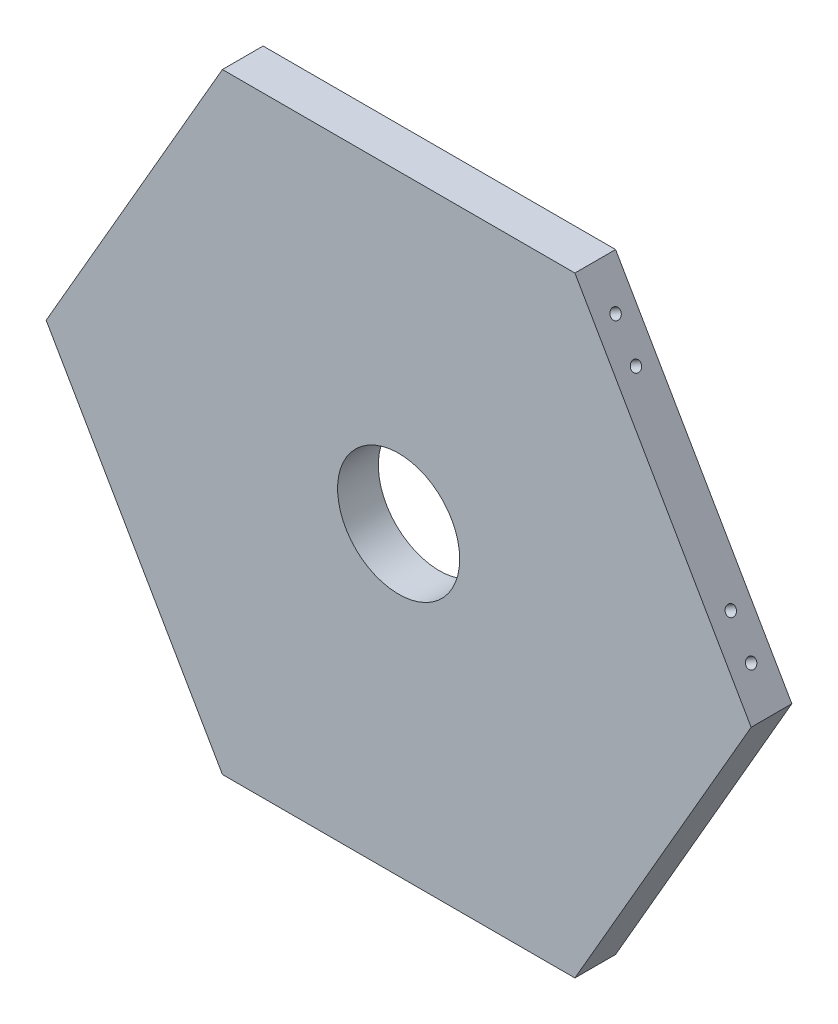
ISO-10303-21;
HEADER;
FILE_DESCRIPTION(('STEP AP214'),'2;1');
FILE_NAME('part.step','',(''),(''),'','','');
FILE_SCHEMA(('AUTOMOTIVE_DESIGN { 1 0 10303 214 1 1 1 1 }'));
ENDSEC;
DATA;
#1=APPLICATION_CONTEXT('core data for automotive mechanical design processes');
#2=APPLICATION_PROTOCOL_DEFINITION('international standard','automotive_design',2000,#1);
#3=PRODUCT_CONTEXT('',#1,'mechanical');
#4=PRODUCT('Part','Part','',(#3));
#5=PRODUCT_RELATED_PRODUCT_CATEGORY('part','',(#4));
#6=PRODUCT_DEFINITION_FORMATION('','',#4);
#7=PRODUCT_DEFINITION_CONTEXT('part definition',#1,'design');
#8=PRODUCT_DEFINITION('design','',#6,#7);
#9=PRODUCT_DEFINITION_SHAPE('','',#8);
#10=(LENGTH_UNIT() NAMED_UNIT(*) SI_UNIT(.MILLI.,.METRE.));
#11=(NAMED_UNIT(*) PLANE_ANGLE_UNIT() SI_UNIT($,.RADIAN.));
#12=(NAMED_UNIT(*) SI_UNIT($,.STERADIAN.) SOLID_ANGLE_UNIT());
#13=UNCERTAINTY_MEASURE_WITH_UNIT(LENGTH_MEASURE(1.E-05),#10,'distance_accuracy_value','');
#14=(GEOMETRIC_REPRESENTATION_CONTEXT(3) GLOBAL_UNCERTAINTY_ASSIGNED_CONTEXT((#13)) GLOBAL_UNIT_ASSIGNED_CONTEXT((#10,
#11,#12)) REPRESENTATION_CONTEXT('',''));
#15=CARTESIAN_POINT('',(0.,0.,0.));
#16=DIRECTION('',(0.,0.,1.));
#17=DIRECTION('',(1.,0.,0.));
#18=AXIS2_PLACEMENT_3D('',#15,#16,#17);
#19=CARTESIAN_POINT('',(-43.301270189222,-75.,10.));
#20=DIRECTION('',(0.,1.,0.));
#21=DIRECTION('',(-1.,0.,0.));
#22=AXIS2_PLACEMENT_3D('',#19,#20,#21);
#23=PLANE('',#22);
#24=CARTESIAN_POINT('',(-33.301270189222,-75.,5.));
#25=DIRECTION('',(0.,-1.,0.));
#26=DIRECTION('',(1.,0.,0.));
#27=AXIS2_PLACEMENT_3D('',#24,#25,#26);
#28=CIRCLE('',#27,1.25);
#29=CARTESIAN_POINT('',(-32.051270189222,-75.,5.));
#30=VERTEX_POINT('',#29);
#31=EDGE_CURVE('E187',#30,#30,#28,.T.);
#32=ORIENTED_EDGE('',*,*,#31,.F.);
#33=EDGE_LOOP('',(#32));
#34=FACE_BOUND('',#33,.T.);
#35=CARTESIAN_POINT('',(23.3012701892219,-75.,5.));
#36=DIRECTION('',(0.,-1.,0.));
#37=DIRECTION('',(-1.,0.,0.));
#38=AXIS2_PLACEMENT_3D('',#35,#36,#37);
#39=CIRCLE('',#38,1.25);
#40=CARTESIAN_POINT('',(22.0512701892219,-75.,5.));
#41=VERTEX_POINT('',#40);
#42=EDGE_CURVE('E191',#41,#41,#39,.T.);
#43=ORIENTED_EDGE('',*,*,#42,.F.);
#44=EDGE_LOOP('',(#43));
#45=FACE_BOUND('',#44,.T.);
#46=CARTESIAN_POINT('',(33.3012701892219,-75.,5.));
#47=DIRECTION('',(0.,-1.,0.));
#48=DIRECTION('',(-1.,0.,0.));
#49=AXIS2_PLACEMENT_3D('',#46,#47,#48);
#50=CIRCLE('',#49,1.25);
#51=CARTESIAN_POINT('',(32.0512701892219,-75.,5.));
#52=VERTEX_POINT('',#51);
#53=EDGE_CURVE('E195',#52,#52,#50,.T.);
#54=ORIENTED_EDGE('',*,*,#53,.F.);
#55=EDGE_LOOP('',(#54));
#56=FACE_BOUND('',#55,.T.);
#57=CARTESIAN_POINT('',(-23.301270189222,-75.,5.));
#58=DIRECTION('',(0.,-1.,0.));
#59=DIRECTION('',(1.,0.,0.));
#60=AXIS2_PLACEMENT_3D('',#57,#58,#59);
#61=CIRCLE('',#60,1.25);
#62=CARTESIAN_POINT('',(-22.051270189222,-75.,5.));
#63=VERTEX_POINT('',#62);
#64=EDGE_CURVE('E198',#63,#63,#61,.T.);
#65=ORIENTED_EDGE('',*,*,#64,.F.);
#66=EDGE_LOOP('',(#65));
#67=FACE_BOUND('',#66,.T.);
#68=DIRECTION('',(1.,0.,0.));
#69=VECTOR('',#68,1.);
#70=CARTESIAN_POINT('',(-43.301270189222,-75.,0.));
#71=LINE('',#70,#69);
#72=CARTESIAN_POINT('',(-43.301270189222,-75.,0.));
#73=VERTEX_POINT('',#72);
#74=CARTESIAN_POINT('',(43.3012701892219,-75.,0.));
#75=VERTEX_POINT('',#74);
#76=EDGE_CURVE('E131',#73,#75,#71,.T.);
#77=ORIENTED_EDGE('',*,*,#76,.T.);
#78=DIRECTION('',(0.,0.,-1.));
#79=VECTOR('',#78,1.);
#80=CARTESIAN_POINT('',(43.3012701892219,-75.,10.));
#81=LINE('',#80,#79);
#82=CARTESIAN_POINT('',(43.3012701892219,-75.,10.));
#83=VERTEX_POINT('',#82);
#84=EDGE_CURVE('E11',#83,#75,#81,.T.);
#85=ORIENTED_EDGE('',*,*,#84,.F.);
#86=DIRECTION('',(1.,0.,0.));
#87=VECTOR('',#86,1.);
#88=CARTESIAN_POINT('',(-43.301270189222,-75.,10.));
#89=LINE('',#88,#87);
#90=CARTESIAN_POINT('',(-43.301270189222,-75.,10.));
#91=VERTEX_POINT('',#90);
#92=EDGE_CURVE('E148',#91,#83,#89,.T.);
#93=ORIENTED_EDGE('',*,*,#92,.F.);
#94=DIRECTION('',(0.,0.,-1.));
#95=VECTOR('',#94,1.);
#96=CARTESIAN_POINT('',(-43.301270189222,-75.,10.));
#97=LINE('',#96,#95);
#98=EDGE_CURVE('E127',#91,#73,#97,.T.);
#99=ORIENTED_EDGE('',*,*,#98,.T.);
#100=EDGE_LOOP('',(#77,#85,#93,#99));
#101=FACE_BOUND('',#100,.T.);
#102=ADVANCED_FACE('F42',(#34,#45,#56,#67,#101),#23,.F.);
#103=CARTESIAN_POINT('',(43.3012701892219,-75.,10.));
#104=DIRECTION('',(-0.866025403784438,0.5,0.));
#105=DIRECTION('',(-0.5,-0.866025403784439,0.));
#106=AXIS2_PLACEMENT_3D('',#103,#104,#105);
#107=PLANE('',#106);
#108=DIRECTION('',(0.5,0.866025403784438,0.));
#109=VECTOR('',#108,1.);
#110=CARTESIAN_POINT('',(43.3012701892219,-75.,0.));
#111=LINE('',#110,#109);
#112=CARTESIAN_POINT('',(86.6025403784439,0.,0.));
#113=VERTEX_POINT('',#112);
#114=EDGE_CURVE('E135',#75,#113,#111,.T.);
#115=ORIENTED_EDGE('',*,*,#114,.T.);
#116=DIRECTION('',(0.,0.,-1.));
#117=VECTOR('',#116,1.);
#118=CARTESIAN_POINT('',(86.6025403784439,0.,10.));
#119=LINE('',#118,#117);
#120=CARTESIAN_POINT('',(86.6025403784439,0.,10.));
#121=VERTEX_POINT('',#120);
#122=EDGE_CURVE('E51',#121,#113,#119,.T.);
#123=ORIENTED_EDGE('',*,*,#122,.F.);
#124=DIRECTION('',(0.5,0.866025403784438,0.));
#125=VECTOR('',#124,1.);
#126=CARTESIAN_POINT('',(43.3012701892219,-75.,10.));
#127=LINE('',#126,#125);
#128=EDGE_CURVE('E96',#83,#121,#127,.T.);
#129=ORIENTED_EDGE('',*,*,#128,.F.);
#130=ORIENTED_EDGE('',*,*,#84,.T.);
#131=EDGE_LOOP('',(#115,#123,#129,#130));
#132=FACE_BOUND('',#131,.T.);
#133=ADVANCED_FACE('F179',(#132),#107,.F.);
#134=CARTESIAN_POINT('',(86.6025403784439,0.,10.));
#135=DIRECTION('',(-0.866025403784439,-0.5,0.));
#136=DIRECTION('',(0.5,-0.866025403784439,0.));
#137=AXIS2_PLACEMENT_3D('',#134,#135,#136);
#138=PLANE('',#137);
#139=CARTESIAN_POINT('',(53.3012701892217,57.6794919243115,5.));
#140=DIRECTION('',(0.866025403784437,0.500000000000004,0.));
#141=DIRECTION('',(0.500000000000004,-0.866025403784437,0.));
#142=AXIS2_PLACEMENT_3D('',#139,#140,#141);
#143=CIRCLE('',#142,1.25);
#144=CARTESIAN_POINT('',(53.9262701892217,56.5969601695809,5.));
#145=VERTEX_POINT('',#144);
#146=EDGE_CURVE('E270',#145,#145,#143,.T.);
#147=ORIENTED_EDGE('',*,*,#146,.F.);
#148=EDGE_LOOP('',(#147));
#149=FACE_BOUND('',#148,.T.);
#150=CARTESIAN_POINT('',(48.3012701892217,66.3397459621559,5.));
#151=DIRECTION('',(0.866025403784437,0.500000000000004,0.));
#152=DIRECTION('',(0.500000000000004,-0.866025403784437,0.));
#153=AXIS2_PLACEMENT_3D('',#150,#151,#152);
#154=CIRCLE('',#153,1.25);
#155=CARTESIAN_POINT('',(48.9262701892217,65.2572142074253,5.));
#156=VERTEX_POINT('',#155);
#157=EDGE_CURVE('E245',#156,#156,#154,.T.);
#158=ORIENTED_EDGE('',*,*,#157,.F.);
#159=EDGE_LOOP('',(#158));
#160=FACE_BOUND('',#159,.T.);
#161=CARTESIAN_POINT('',(76.6025403784438,17.3205080756891,5.));
#162=DIRECTION('',(0.866025403784437,0.500000000000004,0.));
#163=DIRECTION('',(-0.500000000000004,0.866025403784437,0.));
#164=AXIS2_PLACEMENT_3D('',#161,#162,#163);
#165=CIRCLE('',#164,1.25);
#166=CARTESIAN_POINT('',(75.9775403784438,18.4030398304197,5.));
#167=VERTEX_POINT('',#166);
#168=EDGE_CURVE('E254',#167,#167,#165,.T.);
#169=ORIENTED_EDGE('',*,*,#168,.F.);
#170=EDGE_LOOP('',(#169));
#171=FACE_BOUND('',#170,.T.);
#172=CARTESIAN_POINT('',(81.6025403784439,8.66025403784474,5.));
#173=DIRECTION('',(0.866025403784437,0.500000000000004,0.));
#174=DIRECTION('',(-0.500000000000004,0.866025403784437,0.));
#175=AXIS2_PLACEMENT_3D('',#172,#173,#174);
#176=CIRCLE('',#175,1.25);
#177=CARTESIAN_POINT('',(80.9775403784439,9.74278579257528,5.));
#178=VERTEX_POINT('',#177);
#179=EDGE_CURVE('E228',#178,#178,#176,.T.);
#180=ORIENTED_EDGE('',*,*,#179,.F.);
#181=EDGE_LOOP('',(#180));
#182=FACE_BOUND('',#181,.T.);
#183=DIRECTION('',(-0.5,0.866025403784439,0.));
#184=VECTOR('',#183,1.);
#185=CARTESIAN_POINT('',(86.6025403784439,0.,0.));
#186=LINE('',#185,#184);
#187=CARTESIAN_POINT('',(43.3012701892219,75.,0.));
#188=VERTEX_POINT('',#187);
#189=EDGE_CURVE('E139',#113,#188,#186,.T.);
#190=ORIENTED_EDGE('',*,*,#189,.T.);
#191=DIRECTION('',(0.,0.,-1.));
#192=VECTOR('',#191,1.);
#193=CARTESIAN_POINT('',(43.3012701892219,75.,10.));
#194=LINE('',#193,#192);
#195=CARTESIAN_POINT('',(43.3012701892219,75.,10.));
#196=VERTEX_POINT('',#195);
#197=EDGE_CURVE('E120',#196,#188,#194,.T.);
#198=ORIENTED_EDGE('',*,*,#197,.F.);
#199=DIRECTION('',(-0.5,0.866025403784439,0.));
#200=VECTOR('',#199,1.);
#201=CARTESIAN_POINT('',(86.6025403784439,0.,10.));
#202=LINE('',#201,#200);
#203=EDGE_CURVE('E109',#121,#196,#202,.T.);
#204=ORIENTED_EDGE('',*,*,#203,.F.);
#205=ORIENTED_EDGE('',*,*,#122,.T.);
#206=EDGE_LOOP('',(#190,#198,#204,#205));
#207=FACE_BOUND('',#206,.T.);
#208=ADVANCED_FACE('F158',(#149,#160,#171,#182,#207),#138,.F.);
#209=CARTESIAN_POINT('',(43.3012701892219,75.,10.));
#210=DIRECTION('',(0.,-1.,0.));
#211=DIRECTION('',(1.,0.,0.));
#212=AXIS2_PLACEMENT_3D('',#209,#210,#211);
#213=PLANE('',#212);
#214=DIRECTION('',(-1.,0.,0.));
#215=VECTOR('',#214,1.);
#216=CARTESIAN_POINT('',(43.3012701892219,75.,0.));
#217=LINE('',#216,#215);
#218=CARTESIAN_POINT('',(-43.3012701892219,75.0000000000001,0.));
#219=VERTEX_POINT('',#218);
#220=EDGE_CURVE('E118',#188,#219,#217,.T.);
#221=ORIENTED_EDGE('',*,*,#220,.T.);
#222=DIRECTION('',(0.,0.,-1.));
#223=VECTOR('',#222,1.);
#224=CARTESIAN_POINT('',(-43.3012701892219,75.0000000000001,10.));
#225=LINE('',#224,#223);
#226=CARTESIAN_POINT('',(-43.3012701892219,75.0000000000001,10.));
#227=VERTEX_POINT('',#226);
#228=EDGE_CURVE('E115',#227,#219,#225,.T.);
#229=ORIENTED_EDGE('',*,*,#228,.F.);
#230=DIRECTION('',(-1.,0.,0.));
#231=VECTOR('',#230,1.);
#232=CARTESIAN_POINT('',(43.3012701892219,75.,10.));
#233=LINE('',#232,#231);
#234=EDGE_CURVE('E103',#196,#227,#233,.T.);
#235=ORIENTED_EDGE('',*,*,#234,.F.);
#236=ORIENTED_EDGE('',*,*,#197,.T.);
#237=EDGE_LOOP('',(#221,#229,#235,#236));
#238=FACE_BOUND('',#237,.T.);
#239=ADVANCED_FACE('F116',(#238),#213,.F.);
#240=CARTESIAN_POINT('',(-43.3012701892219,75.0000000000001,10.));
#241=DIRECTION('',(0.866025403784439,-0.5,0.));
#242=DIRECTION('',(0.5,0.866025403784439,0.));
#243=AXIS2_PLACEMENT_3D('',#240,#241,#242);
#244=PLANE('',#243);
#245=CARTESIAN_POINT('',(-48.3012701892225,66.3397459621552,5.));
#246=DIRECTION('',(-0.866025403784443,0.499999999999992,0.));
#247=DIRECTION('',(-0.499999999999992,-0.866025403784443,0.));
#248=AXIS2_PLACEMENT_3D('',#245,#246,#247);
#249=CIRCLE('',#248,1.25);
#250=CARTESIAN_POINT('',(-48.9262701892225,65.2572142074246,5.));
#251=VERTEX_POINT('',#250);
#252=EDGE_CURVE('E261',#251,#251,#249,.T.);
#253=ORIENTED_EDGE('',*,*,#252,.F.);
#254=EDGE_LOOP('',(#253));
#255=FACE_BOUND('',#254,.T.);
#256=CARTESIAN_POINT('',(-76.602540378444,17.3205080756881,5.));
#257=DIRECTION('',(-0.866025403784443,0.499999999999992,0.));
#258=DIRECTION('',(0.499999999999992,0.866025403784443,0.));
#259=AXIS2_PLACEMENT_3D('',#256,#257,#258);
#260=CIRCLE('',#259,1.25);
#261=CARTESIAN_POINT('',(-75.9775403784441,18.4030398304186,5.));
#262=VERTEX_POINT('',#261);
#263=EDGE_CURVE('E293',#262,#262,#260,.T.);
#264=ORIENTED_EDGE('',*,*,#263,.F.);
#265=EDGE_LOOP('',(#264));
#266=FACE_BOUND('',#265,.T.);
#267=CARTESIAN_POINT('',(-81.602540378444,8.66025403784365,5.));
#268=DIRECTION('',(-0.866025403784443,0.499999999999992,0.));
#269=DIRECTION('',(0.499999999999992,0.866025403784443,0.));
#270=AXIS2_PLACEMENT_3D('',#267,#268,#269);
#271=CIRCLE('',#270,1.25);
#272=CARTESIAN_POINT('',(-80.977540378444,9.74278579257421,5.));
#273=VERTEX_POINT('',#272);
#274=EDGE_CURVE('E277',#273,#273,#271,.T.);
#275=ORIENTED_EDGE('',*,*,#274,.F.);
#276=EDGE_LOOP('',(#275));
#277=FACE_BOUND('',#276,.T.);
#278=CARTESIAN_POINT('',(-53.3012701892225,57.6794919243108,5.));
#279=DIRECTION('',(-0.866025403784443,0.499999999999992,0.));
#280=DIRECTION('',(-0.499999999999992,-0.866025403784443,0.));
#281=AXIS2_PLACEMENT_3D('',#278,#279,#280);
#282=CIRCLE('',#281,1.25);
#283=CARTESIAN_POINT('',(-53.9262701892224,56.5969601695802,5.));
#284=VERTEX_POINT('',#283);
#285=EDGE_CURVE('E286',#284,#284,#282,.T.);
#286=ORIENTED_EDGE('',*,*,#285,.F.);
#287=EDGE_LOOP('',(#286));
#288=FACE_BOUND('',#287,.T.);
#289=DIRECTION('',(-0.5,-0.866025403784438,0.));
#290=VECTOR('',#289,1.);
#291=CARTESIAN_POINT('',(-43.3012701892219,75.0000000000001,0.));
#292=LINE('',#291,#290);
#293=CARTESIAN_POINT('',(-86.6025403784439,0.,0.));
#294=VERTEX_POINT('',#293);
#295=EDGE_CURVE('E82',#219,#294,#292,.T.);
#296=ORIENTED_EDGE('',*,*,#295,.T.);
#297=DIRECTION('',(0.,0.,-1.));
#298=VECTOR('',#297,1.);
#299=CARTESIAN_POINT('',(-86.6025403784439,0.,10.));
#300=LINE('',#299,#298);
#301=CARTESIAN_POINT('',(-86.6025403784439,0.,10.));
#302=VERTEX_POINT('',#301);
#303=EDGE_CURVE('E121',#302,#294,#300,.T.);
#304=ORIENTED_EDGE('',*,*,#303,.F.);
#305=DIRECTION('',(-0.5,-0.866025403784438,0.));
#306=VECTOR('',#305,1.);
#307=CARTESIAN_POINT('',(-43.3012701892219,75.0000000000001,10.));
#308=LINE('',#307,#306);
#309=EDGE_CURVE('E107',#227,#302,#308,.T.);
#310=ORIENTED_EDGE('',*,*,#309,.F.);
#311=ORIENTED_EDGE('',*,*,#228,.T.);
#312=EDGE_LOOP('',(#296,#304,#310,#311));
#313=FACE_BOUND('',#312,.T.);
#314=ADVANCED_FACE('F123',(#255,#266,#277,#288,#313),#244,.F.);
#315=CARTESIAN_POINT('',(-86.6025403784439,0.,10.));
#316=DIRECTION('',(0.866025403784439,0.5,0.));
#317=DIRECTION('',(-0.5,0.866025403784439,0.));
#318=AXIS2_PLACEMENT_3D('',#315,#316,#317);
#319=PLANE('',#318);
#320=DIRECTION('',(0.5,-0.866025403784439,0.));
#321=VECTOR('',#320,1.);
#322=CARTESIAN_POINT('',(-86.6025403784439,0.,0.));
#323=LINE('',#322,#321);
#324=EDGE_CURVE('E88',#294,#73,#323,.T.);
#325=ORIENTED_EDGE('',*,*,#324,.T.);
#326=ORIENTED_EDGE('',*,*,#98,.F.);
#327=DIRECTION('',(0.5,-0.866025403784439,0.));
#328=VECTOR('',#327,1.);
#329=CARTESIAN_POINT('',(-86.6025403784439,0.,10.));
#330=LINE('',#329,#328);
#331=EDGE_CURVE('E59',#302,#91,#330,.T.);
#332=ORIENTED_EDGE('',*,*,#331,.F.);
#333=ORIENTED_EDGE('',*,*,#303,.T.);
#334=EDGE_LOOP('',(#325,#326,#332,#333));
#335=FACE_BOUND('',#334,.T.);
#336=ADVANCED_FACE('F165',(#335),#319,.F.);
#337=CARTESIAN_POINT('',(0.,0.,10.));
#338=DIRECTION('',(0.,0.,1.));
#339=DIRECTION('',(1.,0.,0.));
#340=AXIS2_PLACEMENT_3D('',#337,#338,#339);
#341=PLANE('',#340);
#342=CARTESIAN_POINT('',(0.,0.,10.));
#343=DIRECTION('',(0.,0.,1.));
#344=DIRECTION('',(1.,0.,0.));
#345=AXIS2_PLACEMENT_3D('',#342,#343,#344);
#346=CIRCLE('',#345,15.);
#347=CARTESIAN_POINT('',(15.,0.,10.));
#348=VERTEX_POINT('',#347);
#349=EDGE_CURVE('E301',#348,#348,#346,.T.);
#350=ORIENTED_EDGE('',*,*,#349,.F.);
#351=EDGE_LOOP('',(#350));
#352=FACE_BOUND('',#351,.T.);
#353=ORIENTED_EDGE('',*,*,#92,.T.);
#354=ORIENTED_EDGE('',*,*,#128,.T.);
#355=ORIENTED_EDGE('',*,*,#203,.T.);
#356=ORIENTED_EDGE('',*,*,#234,.T.);
#357=ORIENTED_EDGE('',*,*,#309,.T.);
#358=ORIENTED_EDGE('',*,*,#331,.T.);
#359=EDGE_LOOP('',(#353,#354,#355,#356,#357,#358));
#360=FACE_BOUND('',#359,.T.);
#361=ADVANCED_FACE('F105',(#352,#360),#341,.T.);
#362=CARTESIAN_POINT('',(0.,0.,0.));
#363=DIRECTION('',(0.,0.,1.));
#364=DIRECTION('',(1.,0.,0.));
#365=AXIS2_PLACEMENT_3D('',#362,#363,#364);
#366=PLANE('',#365);
#367=CARTESIAN_POINT('',(0.,0.,0.));
#368=DIRECTION('',(0.,0.,1.));
#369=DIRECTION('',(1.,0.,0.));
#370=AXIS2_PLACEMENT_3D('',#367,#368,#369);
#371=CIRCLE('',#370,15.);
#372=CARTESIAN_POINT('',(15.,0.,0.));
#373=VERTEX_POINT('',#372);
#374=EDGE_CURVE('E297',#373,#373,#371,.T.);
#375=ORIENTED_EDGE('',*,*,#374,.T.);
#376=EDGE_LOOP('',(#375));
#377=FACE_BOUND('',#376,.T.);
#378=ORIENTED_EDGE('',*,*,#76,.F.);
#379=ORIENTED_EDGE('',*,*,#324,.F.);
#380=ORIENTED_EDGE('',*,*,#295,.F.);
#381=ORIENTED_EDGE('',*,*,#220,.F.);
#382=ORIENTED_EDGE('',*,*,#189,.F.);
#383=ORIENTED_EDGE('',*,*,#114,.F.);
#384=EDGE_LOOP('',(#378,#379,#380,#381,#382,#383));
#385=FACE_BOUND('',#384,.T.);
#386=ADVANCED_FACE('F161',(#377,#385),#366,.F.);
#387=CARTESIAN_POINT('',(-23.301270189222,-70.,5.));
#388=DIRECTION('',(0.,-1.,0.));
#389=DIRECTION('',(1.,0.,0.));
#390=AXIS2_PLACEMENT_3D('',#387,#388,#389);
#391=CYLINDRICAL_SURFACE('',#390,1.25);
#392=CARTESIAN_POINT('',(-23.301270189222,-70.,5.));
#393=DIRECTION('',(0.,-1.,0.));
#394=DIRECTION('',(1.,0.,0.));
#395=AXIS2_PLACEMENT_3D('',#392,#393,#394);
#396=CIRCLE('',#395,1.25);
#397=CARTESIAN_POINT('',(-22.051270189222,-70.,5.));
#398=VERTEX_POINT('',#397);
#399=EDGE_CURVE('E201',#398,#398,#396,.T.);
#400=ORIENTED_EDGE('',*,*,#399,.F.);
#401=EDGE_LOOP('',(#400));
#402=FACE_BOUND('',#401,.T.);
#403=ORIENTED_EDGE('',*,*,#64,.T.);
#404=EDGE_LOOP('',(#403));
#405=FACE_BOUND('',#404,.T.);
#406=ADVANCED_FACE('F396',(#402,#405),#391,.F.);
#407=CARTESIAN_POINT('',(-23.301270189222,-70.,5.));
#408=DIRECTION('',(0.,-1.,0.));
#409=DIRECTION('',(1.,0.,0.));
#410=AXIS2_PLACEMENT_3D('',#407,#408,#409);
#411=PLANE('',#410);
#412=ORIENTED_EDGE('',*,*,#399,.T.);
#413=EDGE_LOOP('',(#412));
#414=FACE_BOUND('',#413,.T.);
#415=ADVANCED_FACE('F399',(#414),#411,.T.);
#416=CARTESIAN_POINT('',(33.3012701892219,-70.,5.));
#417=DIRECTION('',(0.,-1.,0.));
#418=DIRECTION('',(1.,0.,0.));
#419=AXIS2_PLACEMENT_3D('',#416,#417,#418);
#420=CYLINDRICAL_SURFACE('',#419,1.25);
#421=CARTESIAN_POINT('',(33.3012701892219,-70.,5.));
#422=DIRECTION('',(0.,-1.,0.));
#423=DIRECTION('',(-1.,0.,0.));
#424=AXIS2_PLACEMENT_3D('',#421,#422,#423);
#425=CIRCLE('',#424,1.25);
#426=CARTESIAN_POINT('',(32.0512701892219,-70.,5.));
#427=VERTEX_POINT('',#426);
#428=EDGE_CURVE('E214',#427,#427,#425,.T.);
#429=ORIENTED_EDGE('',*,*,#428,.F.);
#430=EDGE_LOOP('',(#429));
#431=FACE_BOUND('',#430,.T.);
#432=ORIENTED_EDGE('',*,*,#53,.T.);
#433=EDGE_LOOP('',(#432));
#434=FACE_BOUND('',#433,.T.);
#435=ADVANCED_FACE('F403',(#431,#434),#420,.F.);
#436=CARTESIAN_POINT('',(33.3012701892219,-70.,5.));
#437=DIRECTION('',(0.,1.,0.));
#438=DIRECTION('',(-1.,0.,0.));
#439=AXIS2_PLACEMENT_3D('',#436,#437,#438);
#440=PLANE('',#439);
#441=ORIENTED_EDGE('',*,*,#428,.T.);
#442=EDGE_LOOP('',(#441));
#443=FACE_BOUND('',#442,.T.);
#444=ADVANCED_FACE('F392',(#443),#440,.F.);
#445=CARTESIAN_POINT('',(23.3012701892219,-70.,5.));
#446=DIRECTION('',(0.,-1.,0.));
#447=DIRECTION('',(1.,0.,0.));
#448=AXIS2_PLACEMENT_3D('',#445,#446,#447);
#449=CYLINDRICAL_SURFACE('',#448,1.25);
#450=CARTESIAN_POINT('',(23.3012701892219,-70.,5.));
#451=DIRECTION('',(0.,-1.,0.));
#452=DIRECTION('',(-1.,0.,0.));
#453=AXIS2_PLACEMENT_3D('',#450,#451,#452);
#454=CIRCLE('',#453,1.25);
#455=CARTESIAN_POINT('',(22.0512701892219,-70.,5.));
#456=VERTEX_POINT('',#455);
#457=EDGE_CURVE('E209',#456,#456,#454,.T.);
#458=ORIENTED_EDGE('',*,*,#457,.F.);
#459=EDGE_LOOP('',(#458));
#460=FACE_BOUND('',#459,.T.);
#461=ORIENTED_EDGE('',*,*,#42,.T.);
#462=EDGE_LOOP('',(#461));
#463=FACE_BOUND('',#462,.T.);
#464=ADVANCED_FACE('F389',(#460,#463),#449,.F.);
#465=CARTESIAN_POINT('',(23.3012701892219,-70.,5.));
#466=DIRECTION('',(0.,1.,0.));
#467=DIRECTION('',(-1.,0.,0.));
#468=AXIS2_PLACEMENT_3D('',#465,#466,#467);
#469=PLANE('',#468);
#470=ORIENTED_EDGE('',*,*,#457,.T.);
#471=EDGE_LOOP('',(#470));
#472=FACE_BOUND('',#471,.T.);
#473=ADVANCED_FACE('F387',(#472),#469,.F.);
#474=CARTESIAN_POINT('',(-33.301270189222,-70.,5.));
#475=DIRECTION('',(0.,-1.,0.));
#476=DIRECTION('',(1.,0.,0.));
#477=AXIS2_PLACEMENT_3D('',#474,#475,#476);
#478=CYLINDRICAL_SURFACE('',#477,1.25);
#479=CARTESIAN_POINT('',(-33.301270189222,-70.,5.));
#480=DIRECTION('',(0.,-1.,0.));
#481=DIRECTION('',(1.,0.,0.));
#482=AXIS2_PLACEMENT_3D('',#479,#480,#481);
#483=CIRCLE('',#482,1.25);
#484=CARTESIAN_POINT('',(-32.051270189222,-70.,5.));
#485=VERTEX_POINT('',#484);
#486=EDGE_CURVE('E136',#485,#485,#483,.T.);
#487=ORIENTED_EDGE('',*,*,#486,.F.);
#488=EDGE_LOOP('',(#487));
#489=FACE_BOUND('',#488,.T.);
#490=ORIENTED_EDGE('',*,*,#31,.T.);
#491=EDGE_LOOP('',(#490));
#492=FACE_BOUND('',#491,.T.);
#493=ADVANCED_FACE('F384',(#489,#492),#478,.F.);
#494=CARTESIAN_POINT('',(-33.301270189222,-70.,5.));
#495=DIRECTION('',(0.,-1.,0.));
#496=DIRECTION('',(1.,0.,0.));
#497=AXIS2_PLACEMENT_3D('',#494,#495,#496);
#498=PLANE('',#497);
#499=ORIENTED_EDGE('',*,*,#486,.T.);
#500=EDGE_LOOP('',(#499));
#501=FACE_BOUND('',#500,.T.);
#502=ADVANCED_FACE('F341',(#501),#498,.T.);
#503=CARTESIAN_POINT('',(-48.9711431703002,55.1794919243108,5.));
#504=DIRECTION('',(-0.866025403784443,0.499999999999992,0.));
#505=DIRECTION('',(-0.499999999999992,-0.866025403784443,0.));
#506=AXIS2_PLACEMENT_3D('',#503,#504,#505);
#507=CYLINDRICAL_SURFACE('',#506,1.25);
#508=CARTESIAN_POINT('',(-48.9711431703002,55.1794919243108,5.));
#509=DIRECTION('',(-0.866025403784443,0.499999999999992,0.));
#510=DIRECTION('',(-0.499999999999992,-0.866025403784443,0.));
#511=AXIS2_PLACEMENT_3D('',#508,#509,#510);
#512=CIRCLE('',#511,1.25);
#513=CARTESIAN_POINT('',(-49.5961431703002,54.0969601695802,5.));
#514=VERTEX_POINT('',#513);
#515=EDGE_CURVE('E266',#514,#514,#512,.T.);
#516=ORIENTED_EDGE('',*,*,#515,.F.);
#517=EDGE_LOOP('',(#516));
#518=FACE_BOUND('',#517,.T.);
#519=ORIENTED_EDGE('',*,*,#285,.T.);
#520=EDGE_LOOP('',(#519));
#521=FACE_BOUND('',#520,.T.);
#522=ADVANCED_FACE('F337',(#518,#521),#507,.F.);
#523=CARTESIAN_POINT('',(-48.9711431703002,55.1794919243108,5.));
#524=DIRECTION('',(-0.866025403784443,0.499999999999992,0.));
#525=DIRECTION('',(-0.499999999999992,-0.866025403784443,0.));
#526=AXIS2_PLACEMENT_3D('',#523,#524,#525);
#527=PLANE('',#526);
#528=ORIENTED_EDGE('',*,*,#515,.T.);
#529=EDGE_LOOP('',(#528));
#530=FACE_BOUND('',#529,.T.);
#531=ADVANCED_FACE('F333',(#530),#527,.T.);
#532=CARTESIAN_POINT('',(-77.2724133595218,6.16025403784369,5.));
#533=DIRECTION('',(-0.866025403784443,0.499999999999992,0.));
#534=DIRECTION('',(-0.499999999999992,-0.866025403784443,0.));
#535=AXIS2_PLACEMENT_3D('',#532,#533,#534);
#536=CYLINDRICAL_SURFACE('',#535,1.25);
#537=CARTESIAN_POINT('',(-77.2724133595218,6.16025403784369,5.));
#538=DIRECTION('',(-0.866025403784443,0.499999999999992,0.));
#539=DIRECTION('',(0.499999999999992,0.866025403784443,0.));
#540=AXIS2_PLACEMENT_3D('',#537,#538,#539);
#541=CIRCLE('',#540,1.25);
#542=CARTESIAN_POINT('',(-76.6474133595218,7.24278579257425,5.));
#543=VERTEX_POINT('',#542);
#544=EDGE_CURVE('E281',#543,#543,#541,.T.);
#545=ORIENTED_EDGE('',*,*,#544,.F.);
#546=EDGE_LOOP('',(#545));
#547=FACE_BOUND('',#546,.T.);
#548=ORIENTED_EDGE('',*,*,#274,.T.);
#549=EDGE_LOOP('',(#548));
#550=FACE_BOUND('',#549,.T.);
#551=ADVANCED_FACE('F336',(#547,#550),#536,.F.);
#552=CARTESIAN_POINT('',(-77.2724133595218,6.16025403784369,5.));
#553=DIRECTION('',(0.866025403784443,-0.499999999999992,0.));
#554=DIRECTION('',(0.499999999999992,0.866025403784443,0.));
#555=AXIS2_PLACEMENT_3D('',#552,#553,#554);
#556=PLANE('',#555);
#557=ORIENTED_EDGE('',*,*,#544,.T.);
#558=EDGE_LOOP('',(#557));
#559=FACE_BOUND('',#558,.T.);
#560=ADVANCED_FACE('F331',(#559),#556,.F.);
#561=CARTESIAN_POINT('',(-72.2724133595218,14.8205080756881,5.));
#562=DIRECTION('',(-0.866025403784443,0.499999999999992,0.));
#563=DIRECTION('',(-0.499999999999992,-0.866025403784443,0.));
#564=AXIS2_PLACEMENT_3D('',#561,#562,#563);
#565=CYLINDRICAL_SURFACE('',#564,1.25);
#566=CARTESIAN_POINT('',(-72.2724133595218,14.8205080756881,5.));
#567=DIRECTION('',(-0.866025403784443,0.499999999999992,0.));
#568=DIRECTION('',(0.499999999999992,0.866025403784443,0.));
#569=AXIS2_PLACEMENT_3D('',#566,#567,#568);
#570=CIRCLE('',#569,1.25);
#571=CARTESIAN_POINT('',(-71.6474133595218,15.9030398304187,5.));
#572=VERTEX_POINT('',#571);
#573=EDGE_CURVE('E282',#572,#572,#570,.T.);
#574=ORIENTED_EDGE('',*,*,#573,.F.);
#575=EDGE_LOOP('',(#574));
#576=FACE_BOUND('',#575,.T.);
#577=ORIENTED_EDGE('',*,*,#263,.T.);
#578=EDGE_LOOP('',(#577));
#579=FACE_BOUND('',#578,.T.);
#580=ADVANCED_FACE('F327',(#576,#579),#565,.F.);
#581=CARTESIAN_POINT('',(-72.2724133595218,14.8205080756881,5.));
#582=DIRECTION('',(0.866025403784443,-0.499999999999992,0.));
#583=DIRECTION('',(0.499999999999992,0.866025403784443,0.));
#584=AXIS2_PLACEMENT_3D('',#581,#582,#583);
#585=PLANE('',#584);
#586=ORIENTED_EDGE('',*,*,#573,.T.);
#587=EDGE_LOOP('',(#586));
#588=FACE_BOUND('',#587,.T.);
#589=ADVANCED_FACE('F323',(#588),#585,.F.);
#590=CARTESIAN_POINT('',(-43.9711431703003,63.8397459621552,5.));
#591=DIRECTION('',(-0.866025403784443,0.499999999999992,0.));
#592=DIRECTION('',(-0.499999999999992,-0.866025403784443,0.));
#593=AXIS2_PLACEMENT_3D('',#590,#591,#592);
#594=CYLINDRICAL_SURFACE('',#593,1.25);
#595=CARTESIAN_POINT('',(-43.9711431703003,63.8397459621552,5.));
#596=DIRECTION('',(-0.866025403784443,0.499999999999992,0.));
#597=DIRECTION('',(-0.499999999999992,-0.866025403784443,0.));
#598=AXIS2_PLACEMENT_3D('',#595,#596,#597);
#599=CIRCLE('',#598,1.25);
#600=CARTESIAN_POINT('',(-44.5961431703003,62.7572142074247,5.));
#601=VERTEX_POINT('',#600);
#602=EDGE_CURVE('E265',#601,#601,#599,.T.);
#603=ORIENTED_EDGE('',*,*,#602,.F.);
#604=EDGE_LOOP('',(#603));
#605=FACE_BOUND('',#604,.T.);
#606=ORIENTED_EDGE('',*,*,#252,.T.);
#607=EDGE_LOOP('',(#606));
#608=FACE_BOUND('',#607,.T.);
#609=ADVANCED_FACE('F326',(#605,#608),#594,.F.);
#610=CARTESIAN_POINT('',(-43.9711431703003,63.8397459621552,5.));
#611=DIRECTION('',(-0.866025403784443,0.499999999999992,0.));
#612=DIRECTION('',(-0.499999999999992,-0.866025403784443,0.));
#613=AXIS2_PLACEMENT_3D('',#610,#611,#612);
#614=PLANE('',#613);
#615=ORIENTED_EDGE('',*,*,#602,.T.);
#616=EDGE_LOOP('',(#615));
#617=FACE_BOUND('',#616,.T.);
#618=ADVANCED_FACE('F353',(#617),#614,.T.);
#619=CARTESIAN_POINT('',(77.2724133595217,6.16025403784472,5.));
#620=DIRECTION('',(0.866025403784436,0.500000000000004,0.));
#621=DIRECTION('',(-0.500000000000004,0.866025403784437,0.));
#622=AXIS2_PLACEMENT_3D('',#619,#620,#621);
#623=CYLINDRICAL_SURFACE('',#622,1.25);
#624=CARTESIAN_POINT('',(77.2724133595217,6.16025403784472,5.));
#625=DIRECTION('',(0.866025403784437,0.500000000000004,0.));
#626=DIRECTION('',(-0.500000000000004,0.866025403784437,0.));
#627=AXIS2_PLACEMENT_3D('',#624,#625,#626);
#628=CIRCLE('',#627,1.25);
#629=CARTESIAN_POINT('',(76.6474133595217,7.24278579257526,5.));
#630=VERTEX_POINT('',#629);
#631=EDGE_CURVE('E234',#630,#630,#628,.T.);
#632=ORIENTED_EDGE('',*,*,#631,.F.);
#633=EDGE_LOOP('',(#632));
#634=FACE_BOUND('',#633,.T.);
#635=ORIENTED_EDGE('',*,*,#179,.T.);
#636=EDGE_LOOP('',(#635));
#637=FACE_BOUND('',#636,.T.);
#638=ADVANCED_FACE('F356',(#634,#637),#623,.F.);
#639=CARTESIAN_POINT('',(77.2724133595217,6.16025403784472,5.));
#640=DIRECTION('',(0.866025403784437,0.500000000000004,0.));
#641=DIRECTION('',(-0.500000000000004,0.866025403784437,0.));
#642=AXIS2_PLACEMENT_3D('',#639,#640,#641);
#643=PLANE('',#642);
#644=ORIENTED_EDGE('',*,*,#631,.T.);
#645=EDGE_LOOP('',(#644));
#646=FACE_BOUND('',#645,.T.);
#647=ADVANCED_FACE('F369',(#646),#643,.T.);
#648=CARTESIAN_POINT('',(72.2724133595216,14.8205080756891,5.));
#649=DIRECTION('',(0.866025403784436,0.500000000000004,0.));
#650=DIRECTION('',(-0.500000000000004,0.866025403784437,0.));
#651=AXIS2_PLACEMENT_3D('',#648,#649,#650);
#652=CYLINDRICAL_SURFACE('',#651,1.25);
#653=CARTESIAN_POINT('',(72.2724133595216,14.8205080756891,5.));
#654=DIRECTION('',(0.866025403784437,0.500000000000004,0.));
#655=DIRECTION('',(-0.500000000000004,0.866025403784437,0.));
#656=AXIS2_PLACEMENT_3D('',#653,#654,#655);
#657=CIRCLE('',#656,1.25);
#658=CARTESIAN_POINT('',(71.6474133595216,15.9030398304196,5.));
#659=VERTEX_POINT('',#658);
#660=EDGE_CURVE('E243',#659,#659,#657,.T.);
#661=ORIENTED_EDGE('',*,*,#660,.F.);
#662=EDGE_LOOP('',(#661));
#663=FACE_BOUND('',#662,.T.);
#664=ORIENTED_EDGE('',*,*,#168,.T.);
#665=EDGE_LOOP('',(#664));
#666=FACE_BOUND('',#665,.T.);
#667=ADVANCED_FACE('F365',(#663,#666),#652,.F.);
#668=CARTESIAN_POINT('',(72.2724133595216,14.8205080756891,5.));
#669=DIRECTION('',(0.866025403784437,0.500000000000004,0.));
#670=DIRECTION('',(-0.500000000000004,0.866025403784437,0.));
#671=AXIS2_PLACEMENT_3D('',#668,#669,#670);
#672=PLANE('',#671);
#673=ORIENTED_EDGE('',*,*,#660,.T.);
#674=EDGE_LOOP('',(#673));
#675=FACE_BOUND('',#674,.T.);
#676=ADVANCED_FACE('F361',(#675),#672,.T.);
#677=CARTESIAN_POINT('',(43.9711431702995,63.8397459621558,5.));
#678=DIRECTION('',(0.866025403784436,0.500000000000004,0.));
#679=DIRECTION('',(-0.500000000000004,0.866025403784437,0.));
#680=AXIS2_PLACEMENT_3D('',#677,#678,#679);
#681=CYLINDRICAL_SURFACE('',#680,1.25);
#682=CARTESIAN_POINT('',(43.9711431702995,63.8397459621558,5.));
#683=DIRECTION('',(0.866025403784437,0.500000000000004,0.));
#684=DIRECTION('',(0.500000000000004,-0.866025403784437,0.));
#685=AXIS2_PLACEMENT_3D('',#682,#683,#684);
#686=CIRCLE('',#685,1.25);
#687=CARTESIAN_POINT('',(44.5961431702995,62.7572142074253,5.));
#688=VERTEX_POINT('',#687);
#689=EDGE_CURVE('E249',#688,#688,#686,.T.);
#690=ORIENTED_EDGE('',*,*,#689,.F.);
#691=EDGE_LOOP('',(#690));
#692=FACE_BOUND('',#691,.T.);
#693=ORIENTED_EDGE('',*,*,#157,.T.);
#694=EDGE_LOOP('',(#693));
#695=FACE_BOUND('',#694,.T.);
#696=ADVANCED_FACE('F364',(#692,#695),#681,.F.);
#697=CARTESIAN_POINT('',(43.9711431702995,63.8397459621558,5.));
#698=DIRECTION('',(-0.866025403784437,-0.500000000000004,0.));
#699=DIRECTION('',(0.500000000000004,-0.866025403784437,0.));
#700=AXIS2_PLACEMENT_3D('',#697,#698,#699);
#701=PLANE('',#700);
#702=ORIENTED_EDGE('',*,*,#689,.T.);
#703=EDGE_LOOP('',(#702));
#704=FACE_BOUND('',#703,.T.);
#705=ADVANCED_FACE('F351',(#704),#701,.F.);
#706=CARTESIAN_POINT('',(48.9711431702995,55.1794919243115,5.));
#707=DIRECTION('',(0.866025403784436,0.500000000000004,0.));
#708=DIRECTION('',(-0.500000000000004,0.866025403784437,0.));
#709=AXIS2_PLACEMENT_3D('',#706,#707,#708);
#710=CYLINDRICAL_SURFACE('',#709,1.25);
#711=CARTESIAN_POINT('',(48.9711431702995,55.1794919243115,5.));
#712=DIRECTION('',(0.866025403784437,0.500000000000004,0.));
#713=DIRECTION('',(0.500000000000004,-0.866025403784437,0.));
#714=AXIS2_PLACEMENT_3D('',#711,#712,#713);
#715=CIRCLE('',#714,1.25);
#716=CARTESIAN_POINT('',(49.5961431702995,54.0969601695809,5.));
#717=VERTEX_POINT('',#716);
#718=EDGE_CURVE('E250',#717,#717,#715,.T.);
#719=ORIENTED_EDGE('',*,*,#718,.F.);
#720=EDGE_LOOP('',(#719));
#721=FACE_BOUND('',#720,.T.);
#722=ORIENTED_EDGE('',*,*,#146,.T.);
#723=EDGE_LOOP('',(#722));
#724=FACE_BOUND('',#723,.T.);
#725=ADVANCED_FACE('F319',(#721,#724),#710,.F.);
#726=CARTESIAN_POINT('',(48.9711431702995,55.1794919243115,5.));
#727=DIRECTION('',(-0.866025403784437,-0.500000000000004,0.));
#728=DIRECTION('',(0.500000000000004,-0.866025403784437,0.));
#729=AXIS2_PLACEMENT_3D('',#726,#727,#728);
#730=PLANE('',#729);
#731=ORIENTED_EDGE('',*,*,#718,.T.);
#732=EDGE_LOOP('',(#731));
#733=FACE_BOUND('',#732,.T.);
#734=ADVANCED_FACE('F313',(#733),#730,.F.);
#735=CARTESIAN_POINT('',(0.,0.,0.));
#736=DIRECTION('',(0.,0.,1.));
#737=DIRECTION('',(1.,0.,0.));
#738=AXIS2_PLACEMENT_3D('',#735,#736,#737);
#739=CYLINDRICAL_SURFACE('',#738,15.);
#740=ORIENTED_EDGE('',*,*,#374,.F.);
#741=EDGE_LOOP('',(#740));
#742=FACE_BOUND('',#741,.T.);
#743=ORIENTED_EDGE('',*,*,#349,.T.);
#744=EDGE_LOOP('',(#743));
#745=FACE_BOUND('',#744,.T.);
#746=ADVANCED_FACE('F310',(#742,#745),#739,.F.);
#747=CLOSED_SHELL('',(#102,#133,#208,#239,#314,#336,#361,#386,#406,#415,#435,#444,#464,#473,
#493,#502,#522,#531,#551,#560,#580,#589,#609,#618,#638,#647,#667,#676,#696,#705,#725,#734,#746));
#748=MANIFOLD_SOLID_BREP('B2',#747);
#749=ADVANCED_BREP_SHAPE_REPRESENTATION('',(#18,#748),#14);
#750=SHAPE_DEFINITION_REPRESENTATION(#9,#749);
ENDSEC;
END-ISO-10303-21;
